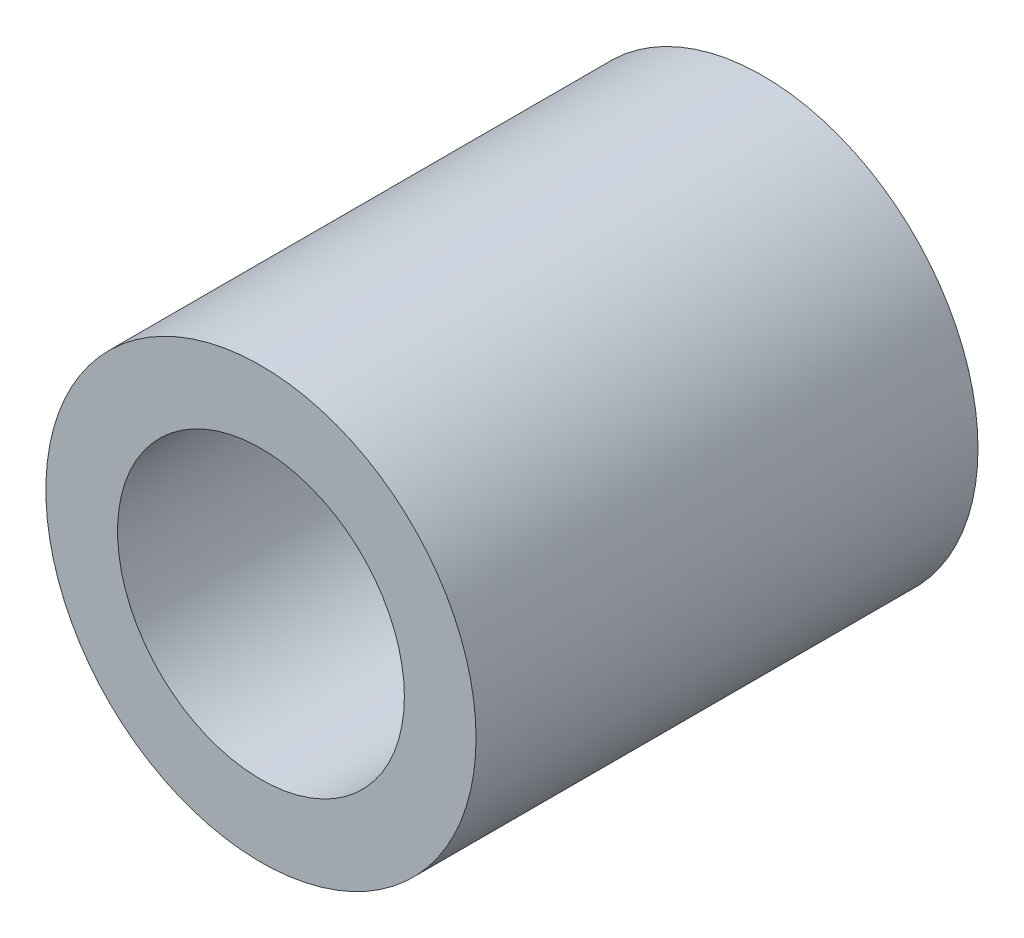
ISO-10303-21;
HEADER;
FILE_DESCRIPTION(('STEP AP214'),'2;1');
FILE_NAME('part.step','',(''),(''),'','','');
FILE_SCHEMA(('AUTOMOTIVE_DESIGN { 1 0 10303 214 1 1 1 1 }'));
ENDSEC;
DATA;
#1=APPLICATION_CONTEXT('core data for automotive mechanical design processes');
#2=APPLICATION_PROTOCOL_DEFINITION('international standard','automotive_design',2000,#1);
#3=PRODUCT_CONTEXT('',#1,'mechanical');
#4=PRODUCT('Part','Part','',(#3));
#5=PRODUCT_RELATED_PRODUCT_CATEGORY('part','',(#4));
#6=PRODUCT_DEFINITION_FORMATION('','',#4);
#7=PRODUCT_DEFINITION_CONTEXT('part definition',#1,'design');
#8=PRODUCT_DEFINITION('design','',#6,#7);
#9=PRODUCT_DEFINITION_SHAPE('','',#8);
#10=(LENGTH_UNIT() NAMED_UNIT(*) SI_UNIT(.MILLI.,.METRE.));
#11=(NAMED_UNIT(*) PLANE_ANGLE_UNIT() SI_UNIT($,.RADIAN.));
#12=(NAMED_UNIT(*) SI_UNIT($,.STERADIAN.) SOLID_ANGLE_UNIT());
#13=UNCERTAINTY_MEASURE_WITH_UNIT(LENGTH_MEASURE(1.E-05),#10,'distance_accuracy_value','');
#14=(GEOMETRIC_REPRESENTATION_CONTEXT(3) GLOBAL_UNCERTAINTY_ASSIGNED_CONTEXT((#13)) GLOBAL_UNIT_ASSIGNED_CONTEXT((#10,
#11,#12)) REPRESENTATION_CONTEXT('',''));
#15=CARTESIAN_POINT('',(0.,0.,0.));
#16=DIRECTION('',(0.,0.,1.));
#17=DIRECTION('',(1.,0.,0.));
#18=AXIS2_PLACEMENT_3D('',#15,#16,#17);
#19=CARTESIAN_POINT('',(0.,0.,7.));
#20=DIRECTION('',(0.,0.,1.));
#21=DIRECTION('',(1.,0.,0.));
#22=AXIS2_PLACEMENT_3D('',#19,#20,#21);
#23=PLANE('',#22);
#24=CARTESIAN_POINT('',(0.,0.,7.));
#25=DIRECTION('',(0.,0.,1.));
#26=DIRECTION('',(1.,0.,0.));
#27=AXIS2_PLACEMENT_3D('',#24,#25,#26);
#28=CIRCLE('',#27,3.);
#29=CARTESIAN_POINT('',(3.,0.,7.));
#30=VERTEX_POINT('',#29);
#31=EDGE_CURVE('E10',#30,#30,#28,.T.);
#32=ORIENTED_EDGE('',*,*,#31,.T.);
#33=EDGE_LOOP('',(#32));
#34=FACE_BOUND('',#33,.T.);
#35=CARTESIAN_POINT('',(0.,0.,7.));
#36=DIRECTION('',(0.,0.,1.));
#37=DIRECTION('',(1.,0.,0.));
#38=AXIS2_PLACEMENT_3D('',#35,#36,#37);
#39=CIRCLE('',#38,2.);
#40=CARTESIAN_POINT('',(2.,0.,7.));
#41=VERTEX_POINT('',#40);
#42=EDGE_CURVE('E44',#41,#41,#39,.T.);
#43=ORIENTED_EDGE('',*,*,#42,.F.);
#44=EDGE_LOOP('',(#43));
#45=FACE_BOUND('',#44,.T.);
#46=ADVANCED_FACE('F33',(#34,#45),#23,.T.);
#47=CARTESIAN_POINT('',(0.,0.,0.));
#48=DIRECTION('',(0.,0.,1.));
#49=DIRECTION('',(1.,0.,0.));
#50=AXIS2_PLACEMENT_3D('',#47,#48,#49);
#51=PLANE('',#50);
#52=CARTESIAN_POINT('',(0.,0.,0.));
#53=DIRECTION('',(0.,0.,1.));
#54=DIRECTION('',(1.,0.,0.));
#55=AXIS2_PLACEMENT_3D('',#52,#53,#54);
#56=CIRCLE('',#55,3.);
#57=CARTESIAN_POINT('',(3.,0.,0.));
#58=VERTEX_POINT('',#57);
#59=EDGE_CURVE('E37',#58,#58,#56,.T.);
#60=ORIENTED_EDGE('',*,*,#59,.F.);
#61=EDGE_LOOP('',(#60));
#62=FACE_BOUND('',#61,.T.);
#63=CARTESIAN_POINT('',(0.,0.,0.));
#64=DIRECTION('',(0.,0.,1.));
#65=DIRECTION('',(1.,0.,0.));
#66=AXIS2_PLACEMENT_3D('',#63,#64,#65);
#67=CIRCLE('',#66,2.);
#68=CARTESIAN_POINT('',(2.,0.,0.));
#69=VERTEX_POINT('',#68);
#70=EDGE_CURVE('E46',#69,#69,#67,.T.);
#71=ORIENTED_EDGE('',*,*,#70,.T.);
#72=EDGE_LOOP('',(#71));
#73=FACE_BOUND('',#72,.T.);
#74=ADVANCED_FACE('F56',(#62,#73),#51,.F.);
#75=CARTESIAN_POINT('',(0.,0.,7.));
#76=DIRECTION('',(0.,0.,-1.));
#77=DIRECTION('',(-1.,0.,0.));
#78=AXIS2_PLACEMENT_3D('',#75,#76,#77);
#79=CYLINDRICAL_SURFACE('',#78,3.);
#80=ORIENTED_EDGE('',*,*,#31,.F.);
#81=EDGE_LOOP('',(#80));
#82=FACE_BOUND('',#81,.T.);
#83=ORIENTED_EDGE('',*,*,#59,.T.);
#84=EDGE_LOOP('',(#83));
#85=FACE_BOUND('',#84,.T.);
#86=ADVANCED_FACE('F35',(#82,#85),#79,.T.);
#87=CARTESIAN_POINT('',(0.,0.,7.));
#88=DIRECTION('',(0.,0.,-1.));
#89=DIRECTION('',(-1.,0.,0.));
#90=AXIS2_PLACEMENT_3D('',#87,#88,#89);
#91=CYLINDRICAL_SURFACE('',#90,2.);
#92=ORIENTED_EDGE('',*,*,#42,.T.);
#93=EDGE_LOOP('',(#92));
#94=FACE_BOUND('',#93,.T.);
#95=ORIENTED_EDGE('',*,*,#70,.F.);
#96=EDGE_LOOP('',(#95));
#97=FACE_BOUND('',#96,.T.);
#98=ADVANCED_FACE('F52',(#94,#97),#91,.F.);
#99=CLOSED_SHELL('',(#46,#74,#86,#98));
#100=MANIFOLD_SOLID_BREP('B2',#99);
#101=ADVANCED_BREP_SHAPE_REPRESENTATION('',(#18,#100),#14);
#102=SHAPE_DEFINITION_REPRESENTATION(#9,#101);
ENDSEC;
END-ISO-10303-21;
